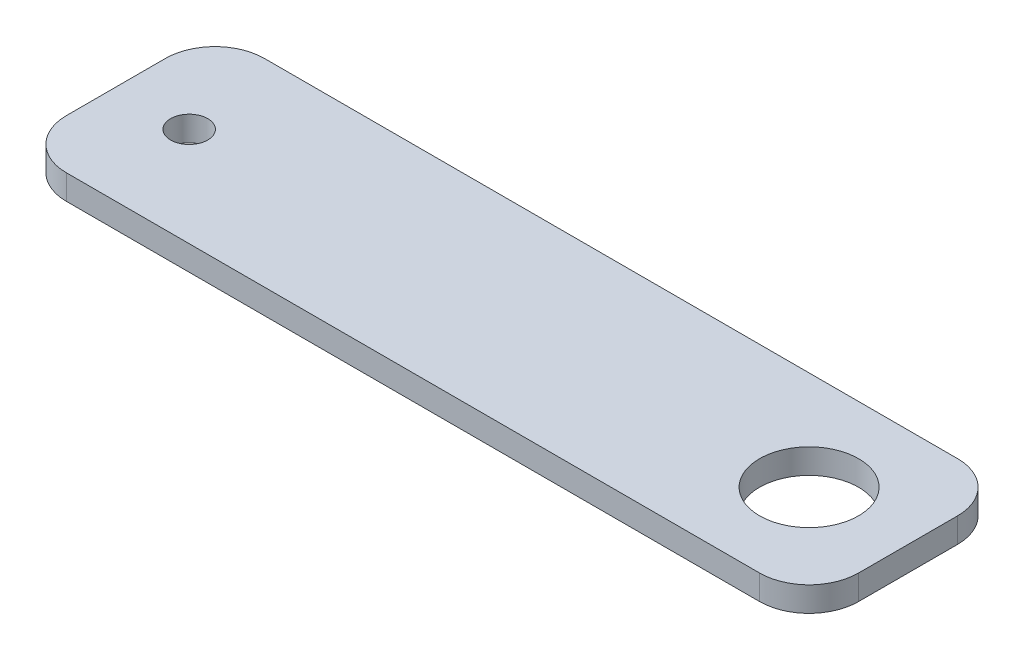
ISO-10303-21;
HEADER;
FILE_DESCRIPTION(('STEP AP214'),'2;1');
FILE_NAME('part.step','',(''),(''),'','','');
FILE_SCHEMA(('AUTOMOTIVE_DESIGN { 1 0 10303 214 1 1 1 1 }'));
ENDSEC;
DATA;
#1=APPLICATION_CONTEXT('core data for automotive mechanical design processes');
#2=APPLICATION_PROTOCOL_DEFINITION('international standard','automotive_design',2000,#1);
#3=PRODUCT_CONTEXT('',#1,'mechanical');
#4=PRODUCT('Part','Part','',(#3));
#5=PRODUCT_RELATED_PRODUCT_CATEGORY('part','',(#4));
#6=PRODUCT_DEFINITION_FORMATION('','',#4);
#7=PRODUCT_DEFINITION_CONTEXT('part definition',#1,'design');
#8=PRODUCT_DEFINITION('design','',#6,#7);
#9=PRODUCT_DEFINITION_SHAPE('','',#8);
#10=(LENGTH_UNIT() NAMED_UNIT(*) SI_UNIT(.MILLI.,.METRE.));
#11=(NAMED_UNIT(*) PLANE_ANGLE_UNIT() SI_UNIT($,.RADIAN.));
#12=(NAMED_UNIT(*) SI_UNIT($,.STERADIAN.) SOLID_ANGLE_UNIT());
#13=UNCERTAINTY_MEASURE_WITH_UNIT(LENGTH_MEASURE(1.E-05),#10,'distance_accuracy_value','');
#14=(GEOMETRIC_REPRESENTATION_CONTEXT(3) GLOBAL_UNCERTAINTY_ASSIGNED_CONTEXT((#13)) GLOBAL_UNIT_ASSIGNED_CONTEXT((#10,
#11,#12)) REPRESENTATION_CONTEXT('',''));
#15=CARTESIAN_POINT('',(0.,0.,0.));
#16=DIRECTION('',(0.,0.,1.));
#17=DIRECTION('',(1.,0.,0.));
#18=AXIS2_PLACEMENT_3D('',#15,#16,#17);
#19=CARTESIAN_POINT('',(0.,1.5875,0.));
#20=DIRECTION('',(1.,0.,0.));
#21=DIRECTION('',(0.,0.,-1.));
#22=AXIS2_PLACEMENT_3D('',#19,#20,#21);
#23=PLANE('',#22);
#24=DIRECTION('',(0.,0.,1.));
#25=VECTOR('',#24,1.);
#26=CARTESIAN_POINT('',(0.,0.,0.));
#27=LINE('',#26,#25);
#28=CARTESIAN_POINT('',(0.,0.,-9.525));
#29=VERTEX_POINT('',#28);
#30=CARTESIAN_POINT('',(0.,0.,-3.175));
#31=VERTEX_POINT('',#30);
#32=EDGE_CURVE('E128',#29,#31,#27,.T.);
#33=ORIENTED_EDGE('',*,*,#32,.T.);
#34=DIRECTION('',(0.,-1.,0.));
#35=VECTOR('',#34,1.);
#36=CARTESIAN_POINT('',(0.,1.5875,-3.175));
#37=LINE('',#36,#35);
#38=CARTESIAN_POINT('',(0.,1.5875,-3.175));
#39=VERTEX_POINT('',#38);
#40=EDGE_CURVE('E105',#31,#39,#37,.F.);
#41=ORIENTED_EDGE('',*,*,#40,.T.);
#42=DIRECTION('',(0.,0.,1.));
#43=VECTOR('',#42,1.);
#44=CARTESIAN_POINT('',(0.,1.5875,0.));
#45=LINE('',#44,#43);
#46=CARTESIAN_POINT('',(0.,1.5875,-9.525));
#47=VERTEX_POINT('',#46);
#48=EDGE_CURVE('E138',#47,#39,#45,.T.);
#49=ORIENTED_EDGE('',*,*,#48,.F.);
#50=DIRECTION('',(0.,-1.,0.));
#51=VECTOR('',#50,1.);
#52=CARTESIAN_POINT('',(0.,1.5875,-9.525));
#53=LINE('',#52,#51);
#54=EDGE_CURVE('E110',#47,#29,#53,.T.);
#55=ORIENTED_EDGE('',*,*,#54,.T.);
#56=EDGE_LOOP('',(#33,#41,#49,#55));
#57=FACE_BOUND('',#56,.T.);
#58=ADVANCED_FACE('F33',(#57),#23,.F.);
#59=CARTESIAN_POINT('',(0.,1.5875,0.));
#60=DIRECTION('',(0.,0.,-1.));
#61=DIRECTION('',(-1.,0.,0.));
#62=AXIS2_PLACEMENT_3D('',#59,#60,#61);
#63=PLANE('',#62);
#64=DIRECTION('',(1.,0.,0.));
#65=VECTOR('',#64,1.);
#66=CARTESIAN_POINT('',(0.,1.5875,0.));
#67=LINE('',#66,#65);
#68=CARTESIAN_POINT('',(3.175,1.5875,0.));
#69=VERTEX_POINT('',#68);
#70=CARTESIAN_POINT('',(47.625,1.5875,0.));
#71=VERTEX_POINT('',#70);
#72=EDGE_CURVE('E120',#69,#71,#67,.T.);
#73=ORIENTED_EDGE('',*,*,#72,.F.);
#74=DIRECTION('',(0.,-1.,0.));
#75=VECTOR('',#74,1.);
#76=CARTESIAN_POINT('',(3.175,1.5875,0.));
#77=LINE('',#76,#75);
#78=CARTESIAN_POINT('',(3.175,0.,0.));
#79=VERTEX_POINT('',#78);
#80=EDGE_CURVE('E104',#69,#79,#77,.T.);
#81=ORIENTED_EDGE('',*,*,#80,.T.);
#82=DIRECTION('',(1.,0.,0.));
#83=VECTOR('',#82,1.);
#84=CARTESIAN_POINT('',(0.,0.,0.));
#85=LINE('',#84,#83);
#86=CARTESIAN_POINT('',(47.625,0.,0.));
#87=VERTEX_POINT('',#86);
#88=EDGE_CURVE('E117',#79,#87,#85,.T.);
#89=ORIENTED_EDGE('',*,*,#88,.T.);
#90=DIRECTION('',(0.,-1.,0.));
#91=VECTOR('',#90,1.);
#92=CARTESIAN_POINT('',(47.625,1.5875,0.));
#93=LINE('',#92,#91);
#94=EDGE_CURVE('E122',#87,#71,#93,.F.);
#95=ORIENTED_EDGE('',*,*,#94,.T.);
#96=EDGE_LOOP('',(#73,#81,#89,#95));
#97=FACE_BOUND('',#96,.T.);
#98=ADVANCED_FACE('F116',(#97),#63,.F.);
#99=CARTESIAN_POINT('',(50.8,1.5875,0.));
#100=DIRECTION('',(-1.,0.,0.));
#101=DIRECTION('',(0.,0.,1.));
#102=AXIS2_PLACEMENT_3D('',#99,#100,#101);
#103=PLANE('',#102);
#104=DIRECTION('',(0.,0.,-1.));
#105=VECTOR('',#104,1.);
#106=CARTESIAN_POINT('',(50.8,1.5875,0.));
#107=LINE('',#106,#105);
#108=CARTESIAN_POINT('',(50.8,1.5875,-3.175));
#109=VERTEX_POINT('',#108);
#110=CARTESIAN_POINT('',(50.8,1.5875,-9.525));
#111=VERTEX_POINT('',#110);
#112=EDGE_CURVE('E161',#109,#111,#107,.T.);
#113=ORIENTED_EDGE('',*,*,#112,.F.);
#114=DIRECTION('',(0.,-1.,0.));
#115=VECTOR('',#114,1.);
#116=CARTESIAN_POINT('',(50.8,1.5875,-3.175));
#117=LINE('',#116,#115);
#118=CARTESIAN_POINT('',(50.8,0.,-3.175));
#119=VERTEX_POINT('',#118);
#120=EDGE_CURVE('E11',#109,#119,#117,.T.);
#121=ORIENTED_EDGE('',*,*,#120,.T.);
#122=DIRECTION('',(0.,0.,-1.));
#123=VECTOR('',#122,1.);
#124=CARTESIAN_POINT('',(50.8,0.,0.));
#125=LINE('',#124,#123);
#126=CARTESIAN_POINT('',(50.8,0.,-9.525));
#127=VERTEX_POINT('',#126);
#128=EDGE_CURVE('E127',#119,#127,#125,.T.);
#129=ORIENTED_EDGE('',*,*,#128,.T.);
#130=DIRECTION('',(0.,-1.,0.));
#131=VECTOR('',#130,1.);
#132=CARTESIAN_POINT('',(50.8,1.5875,-9.525));
#133=LINE('',#132,#131);
#134=EDGE_CURVE('E41',#127,#111,#133,.F.);
#135=ORIENTED_EDGE('',*,*,#134,.T.);
#136=EDGE_LOOP('',(#113,#121,#129,#135));
#137=FACE_BOUND('',#136,.T.);
#138=ADVANCED_FACE('F160',(#137),#103,.F.);
#139=CARTESIAN_POINT('',(0.,1.5875,-12.7));
#140=DIRECTION('',(0.,0.,1.));
#141=DIRECTION('',(1.,0.,0.));
#142=AXIS2_PLACEMENT_3D('',#139,#140,#141);
#143=PLANE('',#142);
#144=DIRECTION('',(-1.,0.,0.));
#145=VECTOR('',#144,1.);
#146=CARTESIAN_POINT('',(0.,0.,-12.7));
#147=LINE('',#146,#145);
#148=CARTESIAN_POINT('',(47.625,0.,-12.7));
#149=VERTEX_POINT('',#148);
#150=CARTESIAN_POINT('',(3.175,0.,-12.7));
#151=VERTEX_POINT('',#150);
#152=EDGE_CURVE('E131',#149,#151,#147,.T.);
#153=ORIENTED_EDGE('',*,*,#152,.T.);
#154=DIRECTION('',(0.,-1.,0.));
#155=VECTOR('',#154,1.);
#156=CARTESIAN_POINT('',(3.175,1.5875,-12.7));
#157=LINE('',#156,#155);
#158=CARTESIAN_POINT('',(3.175,1.5875,-12.7));
#159=VERTEX_POINT('',#158);
#160=EDGE_CURVE('E48',#151,#159,#157,.F.);
#161=ORIENTED_EDGE('',*,*,#160,.T.);
#162=DIRECTION('',(-1.,0.,0.));
#163=VECTOR('',#162,1.);
#164=CARTESIAN_POINT('',(0.,1.5875,-12.7));
#165=LINE('',#164,#163);
#166=CARTESIAN_POINT('',(47.625,1.5875,-12.7));
#167=VERTEX_POINT('',#166);
#168=EDGE_CURVE('E139',#167,#159,#165,.T.);
#169=ORIENTED_EDGE('',*,*,#168,.F.);
#170=DIRECTION('',(0.,-1.,0.));
#171=VECTOR('',#170,1.);
#172=CARTESIAN_POINT('',(47.625,1.5875,-12.7));
#173=LINE('',#172,#171);
#174=EDGE_CURVE('E154',#167,#149,#173,.T.);
#175=ORIENTED_EDGE('',*,*,#174,.T.);
#176=EDGE_LOOP('',(#153,#161,#169,#175));
#177=FACE_BOUND('',#176,.T.);
#178=ADVANCED_FACE('F170',(#177),#143,.F.);
#179=CARTESIAN_POINT('',(0.,1.5875,0.));
#180=DIRECTION('',(0.,-1.,0.));
#181=DIRECTION('',(0.,0.,-1.));
#182=AXIS2_PLACEMENT_3D('',#179,#180,#181);
#183=PLANE('',#182);
#184=CARTESIAN_POINT('',(44.45,1.5875,-6.35));
#185=DIRECTION('',(0.,1.,0.));
#186=DIRECTION('',(0.,0.,1.));
#187=AXIS2_PLACEMENT_3D('',#184,#185,#186);
#188=CIRCLE('',#187,3.175);
#189=CARTESIAN_POINT('',(44.45,1.5875,-3.175));
#190=VERTEX_POINT('',#189);
#191=EDGE_CURVE('E186',#190,#190,#188,.T.);
#192=ORIENTED_EDGE('',*,*,#191,.F.);
#193=EDGE_LOOP('',(#192));
#194=FACE_BOUND('',#193,.T.);
#195=CARTESIAN_POINT('',(4.699,1.5875,-6.35));
#196=DIRECTION('',(0.,1.,0.));
#197=DIRECTION('',(0.,0.,1.));
#198=AXIS2_PLACEMENT_3D('',#195,#196,#197);
#199=CIRCLE('',#198,1.190625);
#200=CARTESIAN_POINT('',(4.699,1.5875,-5.159375));
#201=VERTEX_POINT('',#200);
#202=EDGE_CURVE('E180',#201,#201,#199,.T.);
#203=ORIENTED_EDGE('',*,*,#202,.F.);
#204=EDGE_LOOP('',(#203));
#205=FACE_BOUND('',#204,.T.);
#206=ORIENTED_EDGE('',*,*,#48,.T.);
#207=CARTESIAN_POINT('',(3.175,1.5875,-3.175));
#208=DIRECTION('',(0.,-1.,0.));
#209=DIRECTION('',(0.,0.,-1.));
#210=AXIS2_PLACEMENT_3D('',#207,#208,#209);
#211=CIRCLE('',#210,3.175);
#212=EDGE_CURVE('E152',#39,#69,#211,.F.);
#213=ORIENTED_EDGE('',*,*,#212,.T.);
#214=ORIENTED_EDGE('',*,*,#72,.T.);
#215=CARTESIAN_POINT('',(47.625,1.5875,-3.175));
#216=DIRECTION('',(0.,-1.,0.));
#217=DIRECTION('',(0.,0.,-1.));
#218=AXIS2_PLACEMENT_3D('',#215,#216,#217);
#219=CIRCLE('',#218,3.175);
#220=EDGE_CURVE('E148',#71,#109,#219,.F.);
#221=ORIENTED_EDGE('',*,*,#220,.T.);
#222=ORIENTED_EDGE('',*,*,#112,.T.);
#223=CARTESIAN_POINT('',(47.625,1.5875,-9.525));
#224=DIRECTION('',(0.,-1.,0.));
#225=DIRECTION('',(0.,0.,-1.));
#226=AXIS2_PLACEMENT_3D('',#223,#224,#225);
#227=CIRCLE('',#226,3.175);
#228=EDGE_CURVE('E55',#111,#167,#227,.F.);
#229=ORIENTED_EDGE('',*,*,#228,.T.);
#230=ORIENTED_EDGE('',*,*,#168,.T.);
#231=CARTESIAN_POINT('',(3.175,1.5875,-9.525));
#232=DIRECTION('',(0.,-1.,0.));
#233=DIRECTION('',(0.,0.,-1.));
#234=AXIS2_PLACEMENT_3D('',#231,#232,#233);
#235=CIRCLE('',#234,3.175);
#236=EDGE_CURVE('E150',#159,#47,#235,.F.);
#237=ORIENTED_EDGE('',*,*,#236,.T.);
#238=EDGE_LOOP('',(#206,#213,#214,#221,#222,#229,#230,#237));
#239=FACE_BOUND('',#238,.T.);
#240=ADVANCED_FACE('F165',(#194,#205,#239),#183,.F.);
#241=CARTESIAN_POINT('',(0.,0.,0.));
#242=DIRECTION('',(0.,-1.,0.));
#243=DIRECTION('',(0.,0.,-1.));
#244=AXIS2_PLACEMENT_3D('',#241,#242,#243);
#245=PLANE('',#244);
#246=CARTESIAN_POINT('',(44.45,0.,-6.35));
#247=DIRECTION('',(0.,1.,0.));
#248=DIRECTION('',(0.,0.,1.));
#249=AXIS2_PLACEMENT_3D('',#246,#247,#248);
#250=CIRCLE('',#249,3.175);
#251=CARTESIAN_POINT('',(44.45,0.,-3.175));
#252=VERTEX_POINT('',#251);
#253=EDGE_CURVE('E183',#252,#252,#250,.T.);
#254=ORIENTED_EDGE('',*,*,#253,.T.);
#255=EDGE_LOOP('',(#254));
#256=FACE_BOUND('',#255,.T.);
#257=CARTESIAN_POINT('',(4.699,0.,-6.35));
#258=DIRECTION('',(0.,1.,0.));
#259=DIRECTION('',(0.,0.,1.));
#260=AXIS2_PLACEMENT_3D('',#257,#258,#259);
#261=CIRCLE('',#260,1.190625);
#262=CARTESIAN_POINT('',(4.699,0.,-5.159375));
#263=VERTEX_POINT('',#262);
#264=EDGE_CURVE('E133',#263,#263,#261,.T.);
#265=ORIENTED_EDGE('',*,*,#264,.T.);
#266=EDGE_LOOP('',(#265));
#267=FACE_BOUND('',#266,.T.);
#268=ORIENTED_EDGE('',*,*,#88,.F.);
#269=CARTESIAN_POINT('',(3.175,0.,-3.175));
#270=DIRECTION('',(0.,-1.,0.));
#271=DIRECTION('',(0.,0.,-1.));
#272=AXIS2_PLACEMENT_3D('',#269,#270,#271);
#273=CIRCLE('',#272,3.175);
#274=EDGE_CURVE('E100',#79,#31,#273,.T.);
#275=ORIENTED_EDGE('',*,*,#274,.T.);
#276=ORIENTED_EDGE('',*,*,#32,.F.);
#277=CARTESIAN_POINT('',(3.175,0.,-9.525));
#278=DIRECTION('',(0.,-1.,0.));
#279=DIRECTION('',(0.,0.,-1.));
#280=AXIS2_PLACEMENT_3D('',#277,#278,#279);
#281=CIRCLE('',#280,3.175);
#282=EDGE_CURVE('E111',#29,#151,#281,.T.);
#283=ORIENTED_EDGE('',*,*,#282,.T.);
#284=ORIENTED_EDGE('',*,*,#152,.F.);
#285=CARTESIAN_POINT('',(47.625,0.,-9.525));
#286=DIRECTION('',(0.,-1.,0.));
#287=DIRECTION('',(0.,0.,-1.));
#288=AXIS2_PLACEMENT_3D('',#285,#286,#287);
#289=CIRCLE('',#288,3.175);
#290=EDGE_CURVE('E121',#149,#127,#289,.T.);
#291=ORIENTED_EDGE('',*,*,#290,.T.);
#292=ORIENTED_EDGE('',*,*,#128,.F.);
#293=CARTESIAN_POINT('',(47.625,0.,-3.175));
#294=DIRECTION('',(0.,-1.,0.));
#295=DIRECTION('',(0.,0.,-1.));
#296=AXIS2_PLACEMENT_3D('',#293,#294,#295);
#297=CIRCLE('',#296,3.175);
#298=EDGE_CURVE('E126',#119,#87,#297,.T.);
#299=ORIENTED_EDGE('',*,*,#298,.T.);
#300=EDGE_LOOP('',(#268,#275,#276,#283,#284,#291,#292,#299));
#301=FACE_BOUND('',#300,.T.);
#302=ADVANCED_FACE('F124',(#256,#267,#301),#245,.T.);
#303=CARTESIAN_POINT('',(4.699,0.,-6.35));
#304=DIRECTION('',(0.,1.,0.));
#305=DIRECTION('',(0.,0.,1.));
#306=AXIS2_PLACEMENT_3D('',#303,#304,#305);
#307=CYLINDRICAL_SURFACE('',#306,1.190625);
#308=ORIENTED_EDGE('',*,*,#264,.F.);
#309=EDGE_LOOP('',(#308));
#310=FACE_BOUND('',#309,.T.);
#311=ORIENTED_EDGE('',*,*,#202,.T.);
#312=EDGE_LOOP('',(#311));
#313=FACE_BOUND('',#312,.T.);
#314=ADVANCED_FACE('F197',(#310,#313),#307,.F.);
#315=CARTESIAN_POINT('',(44.45,0.,-6.35));
#316=DIRECTION('',(0.,1.,0.));
#317=DIRECTION('',(0.,0.,1.));
#318=AXIS2_PLACEMENT_3D('',#315,#316,#317);
#319=CYLINDRICAL_SURFACE('',#318,3.175);
#320=ORIENTED_EDGE('',*,*,#253,.F.);
#321=EDGE_LOOP('',(#320));
#322=FACE_BOUND('',#321,.T.);
#323=ORIENTED_EDGE('',*,*,#191,.T.);
#324=EDGE_LOOP('',(#323));
#325=FACE_BOUND('',#324,.T.);
#326=ADVANCED_FACE('F194',(#322,#325),#319,.F.);
#327=CARTESIAN_POINT('',(3.175,1.5875,-3.175));
#328=DIRECTION('',(0.,-1.,0.));
#329=DIRECTION('',(0.,0.,-1.));
#330=AXIS2_PLACEMENT_3D('',#327,#328,#329);
#331=CYLINDRICAL_SURFACE('',#330,3.175);
#332=ORIENTED_EDGE('',*,*,#212,.F.);
#333=ORIENTED_EDGE('',*,*,#40,.F.);
#334=ORIENTED_EDGE('',*,*,#274,.F.);
#335=ORIENTED_EDGE('',*,*,#80,.F.);
#336=EDGE_LOOP('',(#332,#333,#334,#335));
#337=FACE_BOUND('',#336,.T.);
#338=ADVANCED_FACE('F103',(#337),#331,.T.);
#339=CARTESIAN_POINT('',(3.175,1.5875,-9.525));
#340=DIRECTION('',(0.,-1.,0.));
#341=DIRECTION('',(0.,0.,-1.));
#342=AXIS2_PLACEMENT_3D('',#339,#340,#341);
#343=CYLINDRICAL_SURFACE('',#342,3.175);
#344=ORIENTED_EDGE('',*,*,#236,.F.);
#345=ORIENTED_EDGE('',*,*,#160,.F.);
#346=ORIENTED_EDGE('',*,*,#282,.F.);
#347=ORIENTED_EDGE('',*,*,#54,.F.);
#348=EDGE_LOOP('',(#344,#345,#346,#347));
#349=FACE_BOUND('',#348,.T.);
#350=ADVANCED_FACE('F174',(#349),#343,.T.);
#351=CARTESIAN_POINT('',(47.625,1.5875,-3.175));
#352=DIRECTION('',(0.,-1.,0.));
#353=DIRECTION('',(0.,0.,-1.));
#354=AXIS2_PLACEMENT_3D('',#351,#352,#353);
#355=CYLINDRICAL_SURFACE('',#354,3.175);
#356=ORIENTED_EDGE('',*,*,#220,.F.);
#357=ORIENTED_EDGE('',*,*,#94,.F.);
#358=ORIENTED_EDGE('',*,*,#298,.F.);
#359=ORIENTED_EDGE('',*,*,#120,.F.);
#360=EDGE_LOOP('',(#356,#357,#358,#359));
#361=FACE_BOUND('',#360,.T.);
#362=ADVANCED_FACE('F225',(#361),#355,.T.);
#363=CARTESIAN_POINT('',(47.625,1.5875,-9.525));
#364=DIRECTION('',(0.,-1.,0.));
#365=DIRECTION('',(0.,0.,-1.));
#366=AXIS2_PLACEMENT_3D('',#363,#364,#365);
#367=CYLINDRICAL_SURFACE('',#366,3.175);
#368=ORIENTED_EDGE('',*,*,#228,.F.);
#369=ORIENTED_EDGE('',*,*,#134,.F.);
#370=ORIENTED_EDGE('',*,*,#290,.F.);
#371=ORIENTED_EDGE('',*,*,#174,.F.);
#372=EDGE_LOOP('',(#368,#369,#370,#371));
#373=FACE_BOUND('',#372,.T.);
#374=ADVANCED_FACE('F35',(#373),#367,.T.);
#375=CLOSED_SHELL('',(#58,#98,#138,#178,#240,#302,#314,#326,#338,#350,#362,#374));
#376=MANIFOLD_SOLID_BREP('B2',#375);
#377=ADVANCED_BREP_SHAPE_REPRESENTATION('',(#18,#376),#14);
#378=SHAPE_DEFINITION_REPRESENTATION(#9,#377);
ENDSEC;
END-ISO-10303-21;
